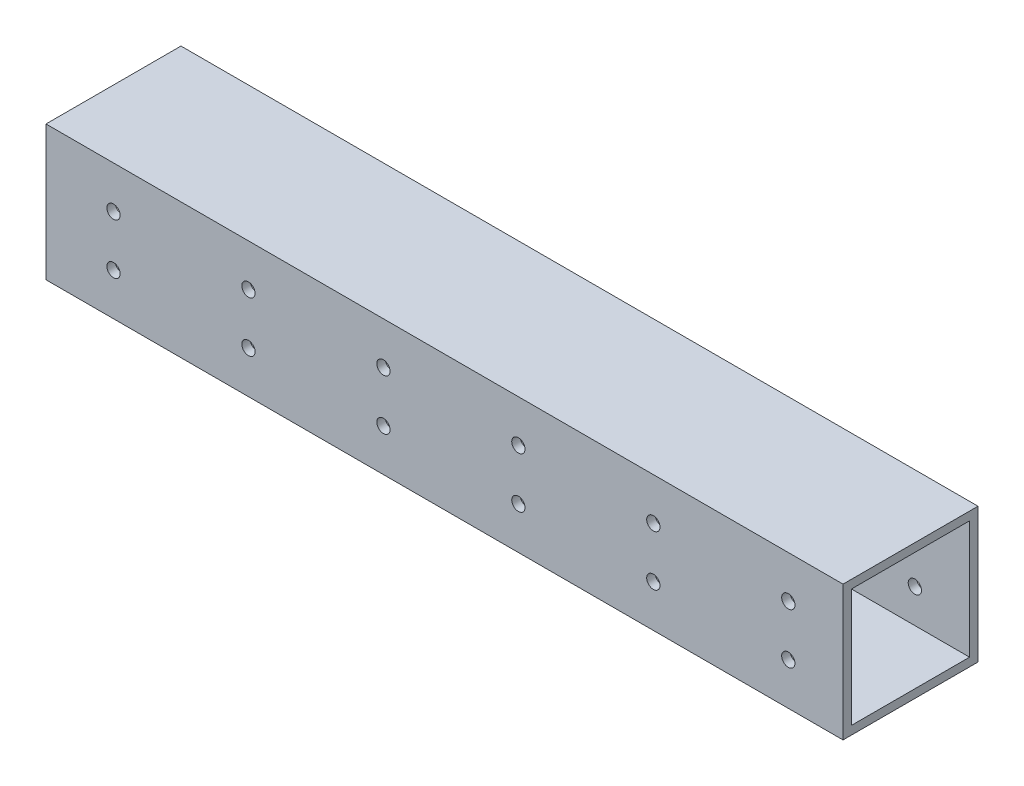
ISO-10303-21;
HEADER;
FILE_DESCRIPTION(('STEP AP214'),'2;1');
FILE_NAME('part.step','',(''),(''),'','','');
FILE_SCHEMA(('AUTOMOTIVE_DESIGN { 1 0 10303 214 1 1 1 1 }'));
ENDSEC;
DATA;
#1=APPLICATION_CONTEXT('core data for automotive mechanical design processes');
#2=APPLICATION_PROTOCOL_DEFINITION('international standard','automotive_design',2000,#1);
#3=PRODUCT_CONTEXT('',#1,'mechanical');
#4=PRODUCT('Part','Part','',(#3));
#5=PRODUCT_RELATED_PRODUCT_CATEGORY('part','',(#4));
#6=PRODUCT_DEFINITION_FORMATION('','',#4);
#7=PRODUCT_DEFINITION_CONTEXT('part definition',#1,'design');
#8=PRODUCT_DEFINITION('design','',#6,#7);
#9=PRODUCT_DEFINITION_SHAPE('','',#8);
#10=(LENGTH_UNIT() NAMED_UNIT(*) SI_UNIT(.MILLI.,.METRE.));
#11=(NAMED_UNIT(*) PLANE_ANGLE_UNIT() SI_UNIT($,.RADIAN.));
#12=(NAMED_UNIT(*) SI_UNIT($,.STERADIAN.) SOLID_ANGLE_UNIT());
#13=UNCERTAINTY_MEASURE_WITH_UNIT(LENGTH_MEASURE(1.E-05),#10,'distance_accuracy_value','');
#14=(GEOMETRIC_REPRESENTATION_CONTEXT(3) GLOBAL_UNCERTAINTY_ASSIGNED_CONTEXT((#13)) GLOBAL_UNIT_ASSIGNED_CONTEXT((#10,
#11,#12)) REPRESENTATION_CONTEXT('',''));
#15=CARTESIAN_POINT('',(0.,0.,0.));
#16=DIRECTION('',(0.,0.,1.));
#17=DIRECTION('',(1.,0.,0.));
#18=AXIS2_PLACEMENT_3D('',#15,#16,#17);
#19=CARTESIAN_POINT('',(300.,3.175,0.));
#20=DIRECTION('',(0.,1.,0.));
#21=DIRECTION('',(0.,0.,1.));
#22=AXIS2_PLACEMENT_3D('',#19,#20,#21);
#23=PLANE('',#22);
#24=DIRECTION('',(0.,0.,-1.));
#25=VECTOR('',#24,1.);
#26=CARTESIAN_POINT('',(0.,3.175,0.));
#27=LINE('',#26,#25);
#28=CARTESIAN_POINT('',(0.,3.175,-3.175));
#29=VERTEX_POINT('',#28);
#30=CARTESIAN_POINT('',(0.,3.175,-47.625));
#31=VERTEX_POINT('',#30);
#32=EDGE_CURVE('E239',#29,#31,#27,.T.);
#33=ORIENTED_EDGE('',*,*,#32,.F.);
#34=DIRECTION('',(-1.,0.,0.));
#35=VECTOR('',#34,1.);
#36=CARTESIAN_POINT('',(300.,3.175,-3.175));
#37=LINE('',#36,#35);
#38=CARTESIAN_POINT('',(300.,3.175,-3.175));
#39=VERTEX_POINT('',#38);
#40=EDGE_CURVE('E11',#39,#29,#37,.T.);
#41=ORIENTED_EDGE('',*,*,#40,.F.);
#42=DIRECTION('',(0.,0.,-1.));
#43=VECTOR('',#42,1.);
#44=CARTESIAN_POINT('',(300.,3.175,0.));
#45=LINE('',#44,#43);
#46=CARTESIAN_POINT('',(300.,3.175,-47.625));
#47=VERTEX_POINT('',#46);
#48=EDGE_CURVE('E123',#39,#47,#45,.T.);
#49=ORIENTED_EDGE('',*,*,#48,.T.);
#50=DIRECTION('',(-1.,0.,0.));
#51=VECTOR('',#50,1.);
#52=CARTESIAN_POINT('',(300.,3.175,-47.625));
#53=LINE('',#52,#51);
#54=EDGE_CURVE('E56',#47,#31,#53,.T.);
#55=ORIENTED_EDGE('',*,*,#54,.T.);
#56=EDGE_LOOP('',(#33,#41,#49,#55));
#57=FACE_BOUND('',#56,.T.);
#58=ADVANCED_FACE('F37',(#57),#23,.T.);
#59=CARTESIAN_POINT('',(300.,0.,-3.175));
#60=DIRECTION('',(0.,0.,1.));
#61=DIRECTION('',(1.,0.,0.));
#62=AXIS2_PLACEMENT_3D('',#59,#60,#61);
#63=PLANE('',#62);
#64=CARTESIAN_POINT('',(279.4,15.875,-3.17499999999998));
#65=DIRECTION('',(0.,0.,1.));
#66=DIRECTION('',(1.,0.,0.));
#67=AXIS2_PLACEMENT_3D('',#64,#65,#66);
#68=CIRCLE('',#67,2.50000000000002);
#69=CARTESIAN_POINT('',(281.9,15.875,-3.17499999999998));
#70=VERTEX_POINT('',#69);
#71=EDGE_CURVE('E212',#70,#70,#68,.T.);
#72=ORIENTED_EDGE('',*,*,#71,.T.);
#73=EDGE_LOOP('',(#72));
#74=FACE_BOUND('',#73,.T.);
#75=CARTESIAN_POINT('',(76.2,34.925,-3.17499999999998));
#76=DIRECTION('',(0.,0.,1.));
#77=DIRECTION('',(1.,0.,0.));
#78=AXIS2_PLACEMENT_3D('',#75,#76,#77);
#79=CIRCLE('',#78,2.5);
#80=CARTESIAN_POINT('',(78.7,34.925,-3.17499999999998));
#81=VERTEX_POINT('',#80);
#82=EDGE_CURVE('E197',#81,#81,#79,.T.);
#83=ORIENTED_EDGE('',*,*,#82,.T.);
#84=EDGE_LOOP('',(#83));
#85=FACE_BOUND('',#84,.T.);
#86=CARTESIAN_POINT('',(127.,34.925,-3.17499999999998));
#87=DIRECTION('',(0.,0.,1.));
#88=DIRECTION('',(1.,0.,0.));
#89=AXIS2_PLACEMENT_3D('',#86,#87,#88);
#90=CIRCLE('',#89,2.5);
#91=CARTESIAN_POINT('',(129.5,34.925,-3.17499999999998));
#92=VERTEX_POINT('',#91);
#93=EDGE_CURVE('E193',#92,#92,#90,.T.);
#94=ORIENTED_EDGE('',*,*,#93,.T.);
#95=EDGE_LOOP('',(#94));
#96=FACE_BOUND('',#95,.T.);
#97=CARTESIAN_POINT('',(177.8,34.925,-3.17499999999998));
#98=DIRECTION('',(0.,0.,1.));
#99=DIRECTION('',(1.,0.,0.));
#100=AXIS2_PLACEMENT_3D('',#97,#98,#99);
#101=CIRCLE('',#100,2.5);
#102=CARTESIAN_POINT('',(180.3,34.925,-3.17499999999998));
#103=VERTEX_POINT('',#102);
#104=EDGE_CURVE('E189',#103,#103,#101,.T.);
#105=ORIENTED_EDGE('',*,*,#104,.T.);
#106=EDGE_LOOP('',(#105));
#107=FACE_BOUND('',#106,.T.);
#108=CARTESIAN_POINT('',(228.6,15.875,-3.17499999999998));
#109=DIRECTION('',(0.,0.,1.));
#110=DIRECTION('',(1.,0.,0.));
#111=AXIS2_PLACEMENT_3D('',#108,#109,#110);
#112=CIRCLE('',#111,2.5);
#113=CARTESIAN_POINT('',(231.1,15.875,-3.17499999999998));
#114=VERTEX_POINT('',#113);
#115=EDGE_CURVE('E185',#114,#114,#112,.T.);
#116=ORIENTED_EDGE('',*,*,#115,.T.);
#117=EDGE_LOOP('',(#116));
#118=FACE_BOUND('',#117,.T.);
#119=CARTESIAN_POINT('',(177.8,15.875,-3.17499999999998));
#120=DIRECTION('',(0.,0.,1.));
#121=DIRECTION('',(1.,0.,0.));
#122=AXIS2_PLACEMENT_3D('',#119,#120,#121);
#123=CIRCLE('',#122,2.5);
#124=CARTESIAN_POINT('',(180.3,15.875,-3.17499999999998));
#125=VERTEX_POINT('',#124);
#126=EDGE_CURVE('E180',#125,#125,#123,.T.);
#127=ORIENTED_EDGE('',*,*,#126,.T.);
#128=EDGE_LOOP('',(#127));
#129=FACE_BOUND('',#128,.T.);
#130=CARTESIAN_POINT('',(127.,15.875,-3.17499999999998));
#131=DIRECTION('',(0.,0.,1.));
#132=DIRECTION('',(1.,0.,0.));
#133=AXIS2_PLACEMENT_3D('',#130,#131,#132);
#134=CIRCLE('',#133,2.5);
#135=CARTESIAN_POINT('',(129.5,15.875,-3.17499999999998));
#136=VERTEX_POINT('',#135);
#137=EDGE_CURVE('E175',#136,#136,#134,.T.);
#138=ORIENTED_EDGE('',*,*,#137,.T.);
#139=EDGE_LOOP('',(#138));
#140=FACE_BOUND('',#139,.T.);
#141=CARTESIAN_POINT('',(76.2,15.875,-3.17499999999998));
#142=DIRECTION('',(0.,0.,1.));
#143=DIRECTION('',(1.,0.,0.));
#144=AXIS2_PLACEMENT_3D('',#141,#142,#143);
#145=CIRCLE('',#144,2.5);
#146=CARTESIAN_POINT('',(78.7,15.875,-3.17499999999998));
#147=VERTEX_POINT('',#146);
#148=EDGE_CURVE('E170',#147,#147,#145,.T.);
#149=ORIENTED_EDGE('',*,*,#148,.T.);
#150=EDGE_LOOP('',(#149));
#151=FACE_BOUND('',#150,.T.);
#152=CARTESIAN_POINT('',(228.6,34.925,-3.17499999999998));
#153=DIRECTION('',(0.,0.,1.));
#154=DIRECTION('',(1.,0.,0.));
#155=AXIS2_PLACEMENT_3D('',#152,#153,#154);
#156=CIRCLE('',#155,2.5);
#157=CARTESIAN_POINT('',(231.1,34.925,-3.17499999999998));
#158=VERTEX_POINT('',#157);
#159=EDGE_CURVE('E165',#158,#158,#156,.T.);
#160=ORIENTED_EDGE('',*,*,#159,.T.);
#161=EDGE_LOOP('',(#160));
#162=FACE_BOUND('',#161,.T.);
#163=CARTESIAN_POINT('',(279.4,34.925,-3.17499999999998));
#164=DIRECTION('',(0.,0.,1.));
#165=DIRECTION('',(1.,0.,0.));
#166=AXIS2_PLACEMENT_3D('',#163,#164,#165);
#167=CIRCLE('',#166,2.50000000000002);
#168=CARTESIAN_POINT('',(281.9,34.925,-3.17499999999998));
#169=VERTEX_POINT('',#168);
#170=EDGE_CURVE('E160',#169,#169,#167,.T.);
#171=ORIENTED_EDGE('',*,*,#170,.T.);
#172=EDGE_LOOP('',(#171));
#173=FACE_BOUND('',#172,.T.);
#174=CARTESIAN_POINT('',(25.4,34.925,-3.17499999999998));
#175=DIRECTION('',(0.,0.,1.));
#176=DIRECTION('',(1.,0.,0.));
#177=AXIS2_PLACEMENT_3D('',#174,#175,#176);
#178=CIRCLE('',#177,2.5);
#179=CARTESIAN_POINT('',(27.9,34.925,-3.17499999999998));
#180=VERTEX_POINT('',#179);
#181=EDGE_CURVE('E155',#180,#180,#178,.T.);
#182=ORIENTED_EDGE('',*,*,#181,.T.);
#183=EDGE_LOOP('',(#182));
#184=FACE_BOUND('',#183,.T.);
#185=CARTESIAN_POINT('',(25.4,15.875,-3.17499999999998));
#186=DIRECTION('',(0.,0.,1.));
#187=DIRECTION('',(1.,0.,0.));
#188=AXIS2_PLACEMENT_3D('',#185,#186,#187);
#189=CIRCLE('',#188,2.5);
#190=CARTESIAN_POINT('',(27.9,15.875,-3.17499999999998));
#191=VERTEX_POINT('',#190);
#192=EDGE_CURVE('E150',#191,#191,#189,.T.);
#193=ORIENTED_EDGE('',*,*,#192,.T.);
#194=EDGE_LOOP('',(#193));
#195=FACE_BOUND('',#194,.T.);
#196=DIRECTION('',(0.,1.,0.));
#197=VECTOR('',#196,1.);
#198=CARTESIAN_POINT('',(0.,0.,-3.175));
#199=LINE('',#198,#197);
#200=CARTESIAN_POINT('',(0.,47.625,-3.175));
#201=VERTEX_POINT('',#200);
#202=EDGE_CURVE('E128',#29,#201,#199,.T.);
#203=ORIENTED_EDGE('',*,*,#202,.T.);
#204=DIRECTION('',(-1.,0.,0.));
#205=VECTOR('',#204,1.);
#206=CARTESIAN_POINT('',(300.,47.625,-3.175));
#207=LINE('',#206,#205);
#208=CARTESIAN_POINT('',(300.,47.625,-3.175));
#209=VERTEX_POINT('',#208);
#210=EDGE_CURVE('E47',#209,#201,#207,.T.);
#211=ORIENTED_EDGE('',*,*,#210,.F.);
#212=DIRECTION('',(0.,1.,0.));
#213=VECTOR('',#212,1.);
#214=CARTESIAN_POINT('',(300.,0.,-3.175));
#215=LINE('',#214,#213);
#216=EDGE_CURVE('E118',#39,#209,#215,.T.);
#217=ORIENTED_EDGE('',*,*,#216,.F.);
#218=ORIENTED_EDGE('',*,*,#40,.T.);
#219=EDGE_LOOP('',(#203,#211,#217,#218));
#220=FACE_BOUND('',#219,.T.);
#221=ADVANCED_FACE('F126',(#74,#85,#96,#107,#118,#129,#140,#151,#162,#173,#184,#195,#220),#63,.F.);
#222=CARTESIAN_POINT('',(300.,47.625,0.));
#223=DIRECTION('',(0.,1.,0.));
#224=DIRECTION('',(0.,0.,1.));
#225=AXIS2_PLACEMENT_3D('',#222,#223,#224);
#226=PLANE('',#225);
#227=DIRECTION('',(0.,0.,-1.));
#228=VECTOR('',#227,1.);
#229=CARTESIAN_POINT('',(0.,47.625,0.));
#230=LINE('',#229,#228);
#231=CARTESIAN_POINT('',(0.,47.625,-47.625));
#232=VERTEX_POINT('',#231);
#233=EDGE_CURVE('E242',#201,#232,#230,.T.);
#234=ORIENTED_EDGE('',*,*,#233,.T.);
#235=DIRECTION('',(-1.,0.,0.));
#236=VECTOR('',#235,1.);
#237=CARTESIAN_POINT('',(300.,47.625,-47.625));
#238=LINE('',#237,#236);
#239=CARTESIAN_POINT('',(300.,47.625,-47.625));
#240=VERTEX_POINT('',#239);
#241=EDGE_CURVE('E82',#240,#232,#238,.T.);
#242=ORIENTED_EDGE('',*,*,#241,.F.);
#243=DIRECTION('',(0.,0.,-1.));
#244=VECTOR('',#243,1.);
#245=CARTESIAN_POINT('',(300.,47.625,0.));
#246=LINE('',#245,#244);
#247=EDGE_CURVE('E110',#209,#240,#246,.T.);
#248=ORIENTED_EDGE('',*,*,#247,.F.);
#249=ORIENTED_EDGE('',*,*,#210,.T.);
#250=EDGE_LOOP('',(#234,#242,#248,#249));
#251=FACE_BOUND('',#250,.T.);
#252=ADVANCED_FACE('F112',(#251),#226,.F.);
#253=CARTESIAN_POINT('',(300.,0.,0.));
#254=DIRECTION('',(0.,1.,0.));
#255=DIRECTION('',(0.,0.,1.));
#256=AXIS2_PLACEMENT_3D('',#253,#254,#255);
#257=PLANE('',#256);
#258=DIRECTION('',(0.,0.,-1.));
#259=VECTOR('',#258,1.);
#260=CARTESIAN_POINT('',(0.,0.,0.));
#261=LINE('',#260,#259);
#262=CARTESIAN_POINT('',(0.,0.,0.));
#263=VERTEX_POINT('',#262);
#264=CARTESIAN_POINT('',(0.,0.,-50.8));
#265=VERTEX_POINT('',#264);
#266=EDGE_CURVE('E215',#263,#265,#261,.T.);
#267=ORIENTED_EDGE('',*,*,#266,.T.);
#268=DIRECTION('',(-1.,0.,0.));
#269=VECTOR('',#268,1.);
#270=CARTESIAN_POINT('',(300.,0.,-50.8));
#271=LINE('',#270,#269);
#272=CARTESIAN_POINT('',(300.,0.,-50.8));
#273=VERTEX_POINT('',#272);
#274=EDGE_CURVE('E139',#273,#265,#271,.T.);
#275=ORIENTED_EDGE('',*,*,#274,.F.);
#276=DIRECTION('',(0.,0.,-1.));
#277=VECTOR('',#276,1.);
#278=CARTESIAN_POINT('',(300.,0.,0.));
#279=LINE('',#278,#277);
#280=CARTESIAN_POINT('',(300.,0.,0.));
#281=VERTEX_POINT('',#280);
#282=EDGE_CURVE('E216',#281,#273,#279,.T.);
#283=ORIENTED_EDGE('',*,*,#282,.F.);
#284=DIRECTION('',(-1.,0.,0.));
#285=VECTOR('',#284,1.);
#286=CARTESIAN_POINT('',(300.,0.,0.));
#287=LINE('',#286,#285);
#288=EDGE_CURVE('E133',#281,#263,#287,.T.);
#289=ORIENTED_EDGE('',*,*,#288,.T.);
#290=EDGE_LOOP('',(#267,#275,#283,#289));
#291=FACE_BOUND('',#290,.T.);
#292=ADVANCED_FACE('F39',(#291),#257,.F.);
#293=CARTESIAN_POINT('',(300.,0.,-50.8));
#294=DIRECTION('',(0.,0.,1.));
#295=DIRECTION('',(1.,0.,0.));
#296=AXIS2_PLACEMENT_3D('',#293,#294,#295);
#297=PLANE('',#296);
#298=CARTESIAN_POINT('',(279.4,15.875,-50.8));
#299=DIRECTION('',(0.,0.,1.));
#300=DIRECTION('',(1.,0.,0.));
#301=AXIS2_PLACEMENT_3D('',#298,#299,#300);
#302=CIRCLE('',#301,2.50000000000002);
#303=CARTESIAN_POINT('',(281.9,15.875,-50.8));
#304=VERTEX_POINT('',#303);
#305=EDGE_CURVE('E209',#304,#304,#302,.T.);
#306=ORIENTED_EDGE('',*,*,#305,.T.);
#307=EDGE_LOOP('',(#306));
#308=FACE_BOUND('',#307,.T.);
#309=CARTESIAN_POINT('',(76.2,34.925,-50.8));
#310=DIRECTION('',(0.,0.,1.));
#311=DIRECTION('',(1.,0.,0.));
#312=AXIS2_PLACEMENT_3D('',#309,#310,#311);
#313=CIRCLE('',#312,2.5);
#314=CARTESIAN_POINT('',(78.7,34.925,-50.8));
#315=VERTEX_POINT('',#314);
#316=EDGE_CURVE('E192',#315,#315,#313,.T.);
#317=ORIENTED_EDGE('',*,*,#316,.T.);
#318=EDGE_LOOP('',(#317));
#319=FACE_BOUND('',#318,.T.);
#320=CARTESIAN_POINT('',(127.,34.925,-50.8));
#321=DIRECTION('',(0.,0.,1.));
#322=DIRECTION('',(1.,0.,0.));
#323=AXIS2_PLACEMENT_3D('',#320,#321,#322);
#324=CIRCLE('',#323,2.5);
#325=CARTESIAN_POINT('',(129.5,34.925,-50.8));
#326=VERTEX_POINT('',#325);
#327=EDGE_CURVE('E188',#326,#326,#324,.T.);
#328=ORIENTED_EDGE('',*,*,#327,.T.);
#329=EDGE_LOOP('',(#328));
#330=FACE_BOUND('',#329,.T.);
#331=CARTESIAN_POINT('',(177.8,34.925,-50.8));
#332=DIRECTION('',(0.,0.,1.));
#333=DIRECTION('',(1.,0.,0.));
#334=AXIS2_PLACEMENT_3D('',#331,#332,#333);
#335=CIRCLE('',#334,2.5);
#336=CARTESIAN_POINT('',(180.3,34.925,-50.8));
#337=VERTEX_POINT('',#336);
#338=EDGE_CURVE('E184',#337,#337,#335,.T.);
#339=ORIENTED_EDGE('',*,*,#338,.T.);
#340=EDGE_LOOP('',(#339));
#341=FACE_BOUND('',#340,.T.);
#342=CARTESIAN_POINT('',(228.6,15.875,-50.8));
#343=DIRECTION('',(0.,0.,1.));
#344=DIRECTION('',(1.,0.,0.));
#345=AXIS2_PLACEMENT_3D('',#342,#343,#344);
#346=CIRCLE('',#345,2.5);
#347=CARTESIAN_POINT('',(231.1,15.875,-50.8));
#348=VERTEX_POINT('',#347);
#349=EDGE_CURVE('E179',#348,#348,#346,.T.);
#350=ORIENTED_EDGE('',*,*,#349,.T.);
#351=EDGE_LOOP('',(#350));
#352=FACE_BOUND('',#351,.T.);
#353=CARTESIAN_POINT('',(177.8,15.875,-50.8));
#354=DIRECTION('',(0.,0.,1.));
#355=DIRECTION('',(1.,0.,0.));
#356=AXIS2_PLACEMENT_3D('',#353,#354,#355);
#357=CIRCLE('',#356,2.5);
#358=CARTESIAN_POINT('',(180.3,15.875,-50.8));
#359=VERTEX_POINT('',#358);
#360=EDGE_CURVE('E174',#359,#359,#357,.T.);
#361=ORIENTED_EDGE('',*,*,#360,.T.);
#362=EDGE_LOOP('',(#361));
#363=FACE_BOUND('',#362,.T.);
#364=CARTESIAN_POINT('',(127.,15.875,-50.8));
#365=DIRECTION('',(0.,0.,1.));
#366=DIRECTION('',(1.,0.,0.));
#367=AXIS2_PLACEMENT_3D('',#364,#365,#366);
#368=CIRCLE('',#367,2.5);
#369=CARTESIAN_POINT('',(129.5,15.875,-50.8));
#370=VERTEX_POINT('',#369);
#371=EDGE_CURVE('E169',#370,#370,#368,.T.);
#372=ORIENTED_EDGE('',*,*,#371,.T.);
#373=EDGE_LOOP('',(#372));
#374=FACE_BOUND('',#373,.T.);
#375=CARTESIAN_POINT('',(76.2,15.875,-50.8));
#376=DIRECTION('',(0.,0.,1.));
#377=DIRECTION('',(1.,0.,0.));
#378=AXIS2_PLACEMENT_3D('',#375,#376,#377);
#379=CIRCLE('',#378,2.5);
#380=CARTESIAN_POINT('',(78.7,15.875,-50.8));
#381=VERTEX_POINT('',#380);
#382=EDGE_CURVE('E164',#381,#381,#379,.T.);
#383=ORIENTED_EDGE('',*,*,#382,.T.);
#384=EDGE_LOOP('',(#383));
#385=FACE_BOUND('',#384,.T.);
#386=CARTESIAN_POINT('',(228.6,34.925,-50.8));
#387=DIRECTION('',(0.,0.,1.));
#388=DIRECTION('',(1.,0.,0.));
#389=AXIS2_PLACEMENT_3D('',#386,#387,#388);
#390=CIRCLE('',#389,2.5);
#391=CARTESIAN_POINT('',(231.1,34.925,-50.8));
#392=VERTEX_POINT('',#391);
#393=EDGE_CURVE('E159',#392,#392,#390,.T.);
#394=ORIENTED_EDGE('',*,*,#393,.T.);
#395=EDGE_LOOP('',(#394));
#396=FACE_BOUND('',#395,.T.);
#397=CARTESIAN_POINT('',(279.4,34.925,-50.8));
#398=DIRECTION('',(0.,0.,1.));
#399=DIRECTION('',(1.,0.,0.));
#400=AXIS2_PLACEMENT_3D('',#397,#398,#399);
#401=CIRCLE('',#400,2.50000000000002);
#402=CARTESIAN_POINT('',(281.9,34.925,-50.8));
#403=VERTEX_POINT('',#402);
#404=EDGE_CURVE('E154',#403,#403,#401,.T.);
#405=ORIENTED_EDGE('',*,*,#404,.T.);
#406=EDGE_LOOP('',(#405));
#407=FACE_BOUND('',#406,.T.);
#408=CARTESIAN_POINT('',(25.4,34.925,-50.8));
#409=DIRECTION('',(0.,0.,1.));
#410=DIRECTION('',(1.,0.,0.));
#411=AXIS2_PLACEMENT_3D('',#408,#409,#410);
#412=CIRCLE('',#411,2.5);
#413=CARTESIAN_POINT('',(27.9,34.925,-50.8));
#414=VERTEX_POINT('',#413);
#415=EDGE_CURVE('E149',#414,#414,#412,.T.);
#416=ORIENTED_EDGE('',*,*,#415,.T.);
#417=EDGE_LOOP('',(#416));
#418=FACE_BOUND('',#417,.T.);
#419=CARTESIAN_POINT('',(25.4,15.875,-50.8));
#420=DIRECTION('',(0.,0.,1.));
#421=DIRECTION('',(1.,0.,0.));
#422=AXIS2_PLACEMENT_3D('',#419,#420,#421);
#423=CIRCLE('',#422,2.5);
#424=CARTESIAN_POINT('',(27.9,15.875,-50.8));
#425=VERTEX_POINT('',#424);
#426=EDGE_CURVE('E144',#425,#425,#423,.T.);
#427=ORIENTED_EDGE('',*,*,#426,.T.);
#428=EDGE_LOOP('',(#427));
#429=FACE_BOUND('',#428,.T.);
#430=DIRECTION('',(0.,1.,0.));
#431=VECTOR('',#430,1.);
#432=CARTESIAN_POINT('',(0.,0.,-50.8));
#433=LINE('',#432,#431);
#434=CARTESIAN_POINT('',(0.,50.8,-50.8));
#435=VERTEX_POINT('',#434);
#436=EDGE_CURVE('E230',#265,#435,#433,.T.);
#437=ORIENTED_EDGE('',*,*,#436,.T.);
#438=DIRECTION('',(-1.,0.,0.));
#439=VECTOR('',#438,1.);
#440=CARTESIAN_POINT('',(300.,50.8,-50.8));
#441=LINE('',#440,#439);
#442=CARTESIAN_POINT('',(300.,50.8,-50.8));
#443=VERTEX_POINT('',#442);
#444=EDGE_CURVE('E137',#443,#435,#441,.T.);
#445=ORIENTED_EDGE('',*,*,#444,.F.);
#446=DIRECTION('',(0.,1.,0.));
#447=VECTOR('',#446,1.);
#448=CARTESIAN_POINT('',(300.,0.,-50.8));
#449=LINE('',#448,#447);
#450=EDGE_CURVE('E95',#273,#443,#449,.T.);
#451=ORIENTED_EDGE('',*,*,#450,.F.);
#452=ORIENTED_EDGE('',*,*,#274,.T.);
#453=EDGE_LOOP('',(#437,#445,#451,#452));
#454=FACE_BOUND('',#453,.T.);
#455=ADVANCED_FACE('F274',(#308,#319,#330,#341,#352,#363,#374,#385,#396,#407,#418,#429,#454),
#297,.F.);
#456=CARTESIAN_POINT('',(300.,50.8,0.));
#457=DIRECTION('',(0.,1.,0.));
#458=DIRECTION('',(0.,0.,1.));
#459=AXIS2_PLACEMENT_3D('',#456,#457,#458);
#460=PLANE('',#459);
#461=DIRECTION('',(0.,0.,-1.));
#462=VECTOR('',#461,1.);
#463=CARTESIAN_POINT('',(0.,50.8,0.));
#464=LINE('',#463,#462);
#465=CARTESIAN_POINT('',(0.,50.8,0.));
#466=VERTEX_POINT('',#465);
#467=EDGE_CURVE('E233',#466,#435,#464,.T.);
#468=ORIENTED_EDGE('',*,*,#467,.F.);
#469=DIRECTION('',(-1.,0.,0.));
#470=VECTOR('',#469,1.);
#471=CARTESIAN_POINT('',(300.,50.8,0.));
#472=LINE('',#471,#470);
#473=CARTESIAN_POINT('',(300.,50.8,0.));
#474=VERTEX_POINT('',#473);
#475=EDGE_CURVE('E135',#474,#466,#472,.T.);
#476=ORIENTED_EDGE('',*,*,#475,.F.);
#477=DIRECTION('',(0.,0.,-1.));
#478=VECTOR('',#477,1.);
#479=CARTESIAN_POINT('',(300.,50.8,0.));
#480=LINE('',#479,#478);
#481=EDGE_CURVE('E220',#474,#443,#480,.T.);
#482=ORIENTED_EDGE('',*,*,#481,.T.);
#483=ORIENTED_EDGE('',*,*,#444,.T.);
#484=EDGE_LOOP('',(#468,#476,#482,#483));
#485=FACE_BOUND('',#484,.T.);
#486=ADVANCED_FACE('F258',(#485),#460,.T.);
#487=CARTESIAN_POINT('',(300.,0.,0.));
#488=DIRECTION('',(0.,0.,1.));
#489=DIRECTION('',(1.,0.,0.));
#490=AXIS2_PLACEMENT_3D('',#487,#488,#489);
#491=PLANE('',#490);
#492=CARTESIAN_POINT('',(279.4,15.875,0.));
#493=DIRECTION('',(0.,0.,1.));
#494=DIRECTION('',(1.,0.,0.));
#495=AXIS2_PLACEMENT_3D('',#492,#493,#494);
#496=CIRCLE('',#495,2.50000000000002);
#497=CARTESIAN_POINT('',(281.9,15.875,0.));
#498=VERTEX_POINT('',#497);
#499=EDGE_CURVE('E456',#498,#498,#496,.T.);
#500=ORIENTED_EDGE('',*,*,#499,.F.);
#501=EDGE_LOOP('',(#500));
#502=FACE_BOUND('',#501,.T.);
#503=CARTESIAN_POINT('',(76.2,34.925,0.));
#504=DIRECTION('',(0.,0.,1.));
#505=DIRECTION('',(1.,0.,0.));
#506=AXIS2_PLACEMENT_3D('',#503,#504,#505);
#507=CIRCLE('',#506,2.5);
#508=CARTESIAN_POINT('',(78.7,34.925,0.));
#509=VERTEX_POINT('',#508);
#510=EDGE_CURVE('E464',#509,#509,#507,.T.);
#511=ORIENTED_EDGE('',*,*,#510,.F.);
#512=EDGE_LOOP('',(#511));
#513=FACE_BOUND('',#512,.T.);
#514=CARTESIAN_POINT('',(127.,34.925,0.));
#515=DIRECTION('',(0.,0.,1.));
#516=DIRECTION('',(1.,0.,0.));
#517=AXIS2_PLACEMENT_3D('',#514,#515,#516);
#518=CIRCLE('',#517,2.5);
#519=CARTESIAN_POINT('',(129.5,34.925,0.));
#520=VERTEX_POINT('',#519);
#521=EDGE_CURVE('E467',#520,#520,#518,.T.);
#522=ORIENTED_EDGE('',*,*,#521,.F.);
#523=EDGE_LOOP('',(#522));
#524=FACE_BOUND('',#523,.T.);
#525=CARTESIAN_POINT('',(177.8,34.925,0.));
#526=DIRECTION('',(0.,0.,1.));
#527=DIRECTION('',(1.,0.,0.));
#528=AXIS2_PLACEMENT_3D('',#525,#526,#527);
#529=CIRCLE('',#528,2.5);
#530=CARTESIAN_POINT('',(180.3,34.925,0.));
#531=VERTEX_POINT('',#530);
#532=EDGE_CURVE('E470',#531,#531,#529,.T.);
#533=ORIENTED_EDGE('',*,*,#532,.F.);
#534=EDGE_LOOP('',(#533));
#535=FACE_BOUND('',#534,.T.);
#536=CARTESIAN_POINT('',(228.6,15.875,0.));
#537=DIRECTION('',(0.,0.,1.));
#538=DIRECTION('',(1.,0.,0.));
#539=AXIS2_PLACEMENT_3D('',#536,#537,#538);
#540=CIRCLE('',#539,2.5);
#541=CARTESIAN_POINT('',(231.1,15.875,0.));
#542=VERTEX_POINT('',#541);
#543=EDGE_CURVE('E452',#542,#542,#540,.T.);
#544=ORIENTED_EDGE('',*,*,#543,.F.);
#545=EDGE_LOOP('',(#544));
#546=FACE_BOUND('',#545,.T.);
#547=CARTESIAN_POINT('',(177.8,15.875,0.));
#548=DIRECTION('',(0.,0.,1.));
#549=DIRECTION('',(1.,0.,0.));
#550=AXIS2_PLACEMENT_3D('',#547,#548,#549);
#551=CIRCLE('',#550,2.5);
#552=CARTESIAN_POINT('',(180.3,15.875,0.));
#553=VERTEX_POINT('',#552);
#554=EDGE_CURVE('E455',#553,#553,#551,.T.);
#555=ORIENTED_EDGE('',*,*,#554,.F.);
#556=EDGE_LOOP('',(#555));
#557=FACE_BOUND('',#556,.T.);
#558=CARTESIAN_POINT('',(127.,15.875,0.));
#559=DIRECTION('',(0.,0.,1.));
#560=DIRECTION('',(1.,0.,0.));
#561=AXIS2_PLACEMENT_3D('',#558,#559,#560);
#562=CIRCLE('',#561,2.5);
#563=CARTESIAN_POINT('',(129.5,15.875,0.));
#564=VERTEX_POINT('',#563);
#565=EDGE_CURVE('E459',#564,#564,#562,.T.);
#566=ORIENTED_EDGE('',*,*,#565,.F.);
#567=EDGE_LOOP('',(#566));
#568=FACE_BOUND('',#567,.T.);
#569=CARTESIAN_POINT('',(76.2,15.875,0.));
#570=DIRECTION('',(0.,0.,1.));
#571=DIRECTION('',(1.,0.,0.));
#572=AXIS2_PLACEMENT_3D('',#569,#570,#571);
#573=CIRCLE('',#572,2.5);
#574=CARTESIAN_POINT('',(78.7,15.875,0.));
#575=VERTEX_POINT('',#574);
#576=EDGE_CURVE('E451',#575,#575,#573,.T.);
#577=ORIENTED_EDGE('',*,*,#576,.F.);
#578=EDGE_LOOP('',(#577));
#579=FACE_BOUND('',#578,.T.);
#580=CARTESIAN_POINT('',(228.6,34.925,0.));
#581=DIRECTION('',(0.,0.,1.));
#582=DIRECTION('',(1.,0.,0.));
#583=AXIS2_PLACEMENT_3D('',#580,#581,#582);
#584=CIRCLE('',#583,2.5);
#585=CARTESIAN_POINT('',(231.1,34.925,0.));
#586=VERTEX_POINT('',#585);
#587=EDGE_CURVE('E473',#586,#586,#584,.T.);
#588=ORIENTED_EDGE('',*,*,#587,.F.);
#589=EDGE_LOOP('',(#588));
#590=FACE_BOUND('',#589,.T.);
#591=CARTESIAN_POINT('',(279.4,34.925,0.));
#592=DIRECTION('',(0.,0.,1.));
#593=DIRECTION('',(1.,0.,0.));
#594=AXIS2_PLACEMENT_3D('',#591,#592,#593);
#595=CIRCLE('',#594,2.50000000000002);
#596=CARTESIAN_POINT('',(281.9,34.925,0.));
#597=VERTEX_POINT('',#596);
#598=EDGE_CURVE('E479',#597,#597,#595,.T.);
#599=ORIENTED_EDGE('',*,*,#598,.F.);
#600=EDGE_LOOP('',(#599));
#601=FACE_BOUND('',#600,.T.);
#602=CARTESIAN_POINT('',(25.4,34.925,0.));
#603=DIRECTION('',(0.,0.,1.));
#604=DIRECTION('',(1.,0.,0.));
#605=AXIS2_PLACEMENT_3D('',#602,#603,#604);
#606=CIRCLE('',#605,2.5);
#607=CARTESIAN_POINT('',(27.9,34.925,0.));
#608=VERTEX_POINT('',#607);
#609=EDGE_CURVE('E476',#608,#608,#606,.T.);
#610=ORIENTED_EDGE('',*,*,#609,.F.);
#611=EDGE_LOOP('',(#610));
#612=FACE_BOUND('',#611,.T.);
#613=CARTESIAN_POINT('',(25.4,15.875,0.));
#614=DIRECTION('',(0.,0.,1.));
#615=DIRECTION('',(1.,0.,0.));
#616=AXIS2_PLACEMENT_3D('',#613,#614,#615);
#617=CIRCLE('',#616,2.5);
#618=CARTESIAN_POINT('',(27.9,15.875,0.));
#619=VERTEX_POINT('',#618);
#620=EDGE_CURVE('E145',#619,#619,#617,.T.);
#621=ORIENTED_EDGE('',*,*,#620,.F.);
#622=EDGE_LOOP('',(#621));
#623=FACE_BOUND('',#622,.T.);
#624=DIRECTION('',(0.,1.,0.));
#625=VECTOR('',#624,1.);
#626=CARTESIAN_POINT('',(0.,0.,0.));
#627=LINE('',#626,#625);
#628=EDGE_CURVE('E236',#263,#466,#627,.T.);
#629=ORIENTED_EDGE('',*,*,#628,.F.);
#630=ORIENTED_EDGE('',*,*,#288,.F.);
#631=DIRECTION('',(0.,1.,0.));
#632=VECTOR('',#631,1.);
#633=CARTESIAN_POINT('',(300.,0.,0.));
#634=LINE('',#633,#632);
#635=EDGE_CURVE('E223',#281,#474,#634,.T.);
#636=ORIENTED_EDGE('',*,*,#635,.T.);
#637=ORIENTED_EDGE('',*,*,#475,.T.);
#638=EDGE_LOOP('',(#629,#630,#636,#637));
#639=FACE_BOUND('',#638,.T.);
#640=ADVANCED_FACE('F249',(#502,#513,#524,#535,#546,#557,#568,#579,#590,#601,#612,#623,#639),
#491,.T.);
#641=CARTESIAN_POINT('',(300.,0.,-47.625));
#642=DIRECTION('',(0.,0.,1.));
#643=DIRECTION('',(1.,0.,0.));
#644=AXIS2_PLACEMENT_3D('',#641,#642,#643);
#645=PLANE('',#644);
#646=CARTESIAN_POINT('',(279.4,15.875,-47.625));
#647=DIRECTION('',(0.,0.,1.));
#648=DIRECTION('',(1.,0.,0.));
#649=AXIS2_PLACEMENT_3D('',#646,#647,#648);
#650=CIRCLE('',#649,2.50000000000002);
#651=CARTESIAN_POINT('',(281.9,15.875,-47.625));
#652=VERTEX_POINT('',#651);
#653=EDGE_CURVE('E41',#652,#652,#650,.T.);
#654=ORIENTED_EDGE('',*,*,#653,.F.);
#655=EDGE_LOOP('',(#654));
#656=FACE_BOUND('',#655,.T.);
#657=CARTESIAN_POINT('',(76.2,34.925,-47.625));
#658=DIRECTION('',(0.,0.,1.));
#659=DIRECTION('',(1.,0.,0.));
#660=AXIS2_PLACEMENT_3D('',#657,#658,#659);
#661=CIRCLE('',#660,2.5);
#662=CARTESIAN_POINT('',(78.7,34.925,-47.625));
#663=VERTEX_POINT('',#662);
#664=EDGE_CURVE('E190',#663,#663,#661,.T.);
#665=ORIENTED_EDGE('',*,*,#664,.F.);
#666=EDGE_LOOP('',(#665));
#667=FACE_BOUND('',#666,.T.);
#668=CARTESIAN_POINT('',(127.,34.925,-47.625));
#669=DIRECTION('',(0.,0.,1.));
#670=DIRECTION('',(1.,0.,0.));
#671=AXIS2_PLACEMENT_3D('',#668,#669,#670);
#672=CIRCLE('',#671,2.5);
#673=CARTESIAN_POINT('',(129.5,34.925,-47.625));
#674=VERTEX_POINT('',#673);
#675=EDGE_CURVE('E186',#674,#674,#672,.T.);
#676=ORIENTED_EDGE('',*,*,#675,.F.);
#677=EDGE_LOOP('',(#676));
#678=FACE_BOUND('',#677,.T.);
#679=CARTESIAN_POINT('',(177.8,34.925,-47.625));
#680=DIRECTION('',(0.,0.,1.));
#681=DIRECTION('',(1.,0.,0.));
#682=AXIS2_PLACEMENT_3D('',#679,#680,#681);
#683=CIRCLE('',#682,2.5);
#684=CARTESIAN_POINT('',(180.3,34.925,-47.625));
#685=VERTEX_POINT('',#684);
#686=EDGE_CURVE('E181',#685,#685,#683,.T.);
#687=ORIENTED_EDGE('',*,*,#686,.F.);
#688=EDGE_LOOP('',(#687));
#689=FACE_BOUND('',#688,.T.);
#690=CARTESIAN_POINT('',(228.6,15.875,-47.625));
#691=DIRECTION('',(0.,0.,1.));
#692=DIRECTION('',(1.,0.,0.));
#693=AXIS2_PLACEMENT_3D('',#690,#691,#692);
#694=CIRCLE('',#693,2.5);
#695=CARTESIAN_POINT('',(231.1,15.875,-47.625));
#696=VERTEX_POINT('',#695);
#697=EDGE_CURVE('E176',#696,#696,#694,.T.);
#698=ORIENTED_EDGE('',*,*,#697,.F.);
#699=EDGE_LOOP('',(#698));
#700=FACE_BOUND('',#699,.T.);
#701=CARTESIAN_POINT('',(177.8,15.875,-47.625));
#702=DIRECTION('',(0.,0.,1.));
#703=DIRECTION('',(1.,0.,0.));
#704=AXIS2_PLACEMENT_3D('',#701,#702,#703);
#705=CIRCLE('',#704,2.5);
#706=CARTESIAN_POINT('',(180.3,15.875,-47.625));
#707=VERTEX_POINT('',#706);
#708=EDGE_CURVE('E171',#707,#707,#705,.T.);
#709=ORIENTED_EDGE('',*,*,#708,.F.);
#710=EDGE_LOOP('',(#709));
#711=FACE_BOUND('',#710,.T.);
#712=CARTESIAN_POINT('',(127.,15.875,-47.625));
#713=DIRECTION('',(0.,0.,1.));
#714=DIRECTION('',(1.,0.,0.));
#715=AXIS2_PLACEMENT_3D('',#712,#713,#714);
#716=CIRCLE('',#715,2.5);
#717=CARTESIAN_POINT('',(129.5,15.875,-47.625));
#718=VERTEX_POINT('',#717);
#719=EDGE_CURVE('E166',#718,#718,#716,.T.);
#720=ORIENTED_EDGE('',*,*,#719,.F.);
#721=EDGE_LOOP('',(#720));
#722=FACE_BOUND('',#721,.T.);
#723=CARTESIAN_POINT('',(76.2,15.875,-47.625));
#724=DIRECTION('',(0.,0.,1.));
#725=DIRECTION('',(1.,0.,0.));
#726=AXIS2_PLACEMENT_3D('',#723,#724,#725);
#727=CIRCLE('',#726,2.5);
#728=CARTESIAN_POINT('',(78.7,15.875,-47.625));
#729=VERTEX_POINT('',#728);
#730=EDGE_CURVE('E161',#729,#729,#727,.T.);
#731=ORIENTED_EDGE('',*,*,#730,.F.);
#732=EDGE_LOOP('',(#731));
#733=FACE_BOUND('',#732,.T.);
#734=CARTESIAN_POINT('',(228.6,34.925,-47.625));
#735=DIRECTION('',(0.,0.,1.));
#736=DIRECTION('',(1.,0.,0.));
#737=AXIS2_PLACEMENT_3D('',#734,#735,#736);
#738=CIRCLE('',#737,2.5);
#739=CARTESIAN_POINT('',(231.1,34.925,-47.625));
#740=VERTEX_POINT('',#739);
#741=EDGE_CURVE('E156',#740,#740,#738,.T.);
#742=ORIENTED_EDGE('',*,*,#741,.F.);
#743=EDGE_LOOP('',(#742));
#744=FACE_BOUND('',#743,.T.);
#745=CARTESIAN_POINT('',(279.4,34.925,-47.625));
#746=DIRECTION('',(0.,0.,1.));
#747=DIRECTION('',(1.,0.,0.));
#748=AXIS2_PLACEMENT_3D('',#745,#746,#747);
#749=CIRCLE('',#748,2.50000000000002);
#750=CARTESIAN_POINT('',(281.9,34.925,-47.625));
#751=VERTEX_POINT('',#750);
#752=EDGE_CURVE('E151',#751,#751,#749,.T.);
#753=ORIENTED_EDGE('',*,*,#752,.F.);
#754=EDGE_LOOP('',(#753));
#755=FACE_BOUND('',#754,.T.);
#756=CARTESIAN_POINT('',(25.4,34.925,-47.625));
#757=DIRECTION('',(0.,0.,1.));
#758=DIRECTION('',(1.,0.,0.));
#759=AXIS2_PLACEMENT_3D('',#756,#757,#758);
#760=CIRCLE('',#759,2.5);
#761=CARTESIAN_POINT('',(27.9,34.925,-47.625));
#762=VERTEX_POINT('',#761);
#763=EDGE_CURVE('E146',#762,#762,#760,.T.);
#764=ORIENTED_EDGE('',*,*,#763,.F.);
#765=EDGE_LOOP('',(#764));
#766=FACE_BOUND('',#765,.T.);
#767=CARTESIAN_POINT('',(25.4,15.875,-47.625));
#768=DIRECTION('',(0.,0.,1.));
#769=DIRECTION('',(1.,0.,0.));
#770=AXIS2_PLACEMENT_3D('',#767,#768,#769);
#771=CIRCLE('',#770,2.5);
#772=CARTESIAN_POINT('',(27.9,15.875,-47.625));
#773=VERTEX_POINT('',#772);
#774=EDGE_CURVE('E141',#773,#773,#771,.T.);
#775=ORIENTED_EDGE('',*,*,#774,.F.);
#776=EDGE_LOOP('',(#775));
#777=FACE_BOUND('',#776,.T.);
#778=DIRECTION('',(0.,1.,0.));
#779=VECTOR('',#778,1.);
#780=CARTESIAN_POINT('',(0.,0.,-47.625));
#781=LINE('',#780,#779);
#782=EDGE_CURVE('E218',#31,#232,#781,.T.);
#783=ORIENTED_EDGE('',*,*,#782,.F.);
#784=ORIENTED_EDGE('',*,*,#54,.F.);
#785=DIRECTION('',(0.,1.,0.));
#786=VECTOR('',#785,1.);
#787=CARTESIAN_POINT('',(300.,0.,-47.625));
#788=LINE('',#787,#786);
#789=EDGE_CURVE('E117',#47,#240,#788,.T.);
#790=ORIENTED_EDGE('',*,*,#789,.T.);
#791=ORIENTED_EDGE('',*,*,#241,.T.);
#792=EDGE_LOOP('',(#783,#784,#790,#791));
#793=FACE_BOUND('',#792,.T.);
#794=ADVANCED_FACE('F247',(#656,#667,#678,#689,#700,#711,#722,#733,#744,#755,#766,#777,#793),
#645,.T.);
#795=CARTESIAN_POINT('',(300.,0.,0.));
#796=DIRECTION('',(1.,0.,0.));
#797=DIRECTION('',(0.,0.,-1.));
#798=AXIS2_PLACEMENT_3D('',#795,#796,#797);
#799=PLANE('',#798);
#800=ORIENTED_EDGE('',*,*,#282,.T.);
#801=ORIENTED_EDGE('',*,*,#450,.T.);
#802=ORIENTED_EDGE('',*,*,#481,.F.);
#803=ORIENTED_EDGE('',*,*,#635,.F.);
#804=EDGE_LOOP('',(#800,#801,#802,#803));
#805=FACE_BOUND('',#804,.T.);
#806=ORIENTED_EDGE('',*,*,#48,.F.);
#807=ORIENTED_EDGE('',*,*,#216,.T.);
#808=ORIENTED_EDGE('',*,*,#247,.T.);
#809=ORIENTED_EDGE('',*,*,#789,.F.);
#810=EDGE_LOOP('',(#806,#807,#808,#809));
#811=FACE_BOUND('',#810,.T.);
#812=ADVANCED_FACE('F122',(#805,#811),#799,.T.);
#813=CARTESIAN_POINT('',(0.,0.,0.));
#814=DIRECTION('',(1.,0.,0.));
#815=DIRECTION('',(0.,0.,-1.));
#816=AXIS2_PLACEMENT_3D('',#813,#814,#815);
#817=PLANE('',#816);
#818=ORIENTED_EDGE('',*,*,#266,.F.);
#819=ORIENTED_EDGE('',*,*,#628,.T.);
#820=ORIENTED_EDGE('',*,*,#467,.T.);
#821=ORIENTED_EDGE('',*,*,#436,.F.);
#822=EDGE_LOOP('',(#818,#819,#820,#821));
#823=FACE_BOUND('',#822,.T.);
#824=ORIENTED_EDGE('',*,*,#32,.T.);
#825=ORIENTED_EDGE('',*,*,#782,.T.);
#826=ORIENTED_EDGE('',*,*,#233,.F.);
#827=ORIENTED_EDGE('',*,*,#202,.F.);
#828=EDGE_LOOP('',(#824,#825,#826,#827));
#829=FACE_BOUND('',#828,.T.);
#830=ADVANCED_FACE('F246',(#823,#829),#817,.F.);
#831=CARTESIAN_POINT('',(25.4,15.875,-300.));
#832=DIRECTION('',(0.,0.,1.));
#833=DIRECTION('',(1.,0.,0.));
#834=AXIS2_PLACEMENT_3D('',#831,#832,#833);
#835=CYLINDRICAL_SURFACE('',#834,2.5);
#836=ORIENTED_EDGE('',*,*,#774,.T.);
#837=EDGE_LOOP('',(#836));
#838=FACE_BOUND('',#837,.T.);
#839=ORIENTED_EDGE('',*,*,#426,.F.);
#840=EDGE_LOOP('',(#839));
#841=FACE_BOUND('',#840,.T.);
#842=ADVANCED_FACE('F324',(#838,#841),#835,.F.);
#843=CARTESIAN_POINT('',(25.4,34.925,-300.));
#844=DIRECTION('',(0.,0.,1.));
#845=DIRECTION('',(1.,0.,0.));
#846=AXIS2_PLACEMENT_3D('',#843,#844,#845);
#847=CYLINDRICAL_SURFACE('',#846,2.5);
#848=ORIENTED_EDGE('',*,*,#763,.T.);
#849=EDGE_LOOP('',(#848));
#850=FACE_BOUND('',#849,.T.);
#851=ORIENTED_EDGE('',*,*,#415,.F.);
#852=EDGE_LOOP('',(#851));
#853=FACE_BOUND('',#852,.T.);
#854=ADVANCED_FACE('F328',(#850,#853),#847,.F.);
#855=CARTESIAN_POINT('',(279.4,34.925,-300.));
#856=DIRECTION('',(0.,0.,1.));
#857=DIRECTION('',(1.,0.,0.));
#858=AXIS2_PLACEMENT_3D('',#855,#856,#857);
#859=CYLINDRICAL_SURFACE('',#858,2.50000000000002);
#860=ORIENTED_EDGE('',*,*,#752,.T.);
#861=EDGE_LOOP('',(#860));
#862=FACE_BOUND('',#861,.T.);
#863=ORIENTED_EDGE('',*,*,#404,.F.);
#864=EDGE_LOOP('',(#863));
#865=FACE_BOUND('',#864,.T.);
#866=ADVANCED_FACE('F384',(#862,#865),#859,.F.);
#867=CARTESIAN_POINT('',(228.6,34.925,-300.));
#868=DIRECTION('',(0.,0.,1.));
#869=DIRECTION('',(1.,0.,0.));
#870=AXIS2_PLACEMENT_3D('',#867,#868,#869);
#871=CYLINDRICAL_SURFACE('',#870,2.5);
#872=ORIENTED_EDGE('',*,*,#741,.T.);
#873=EDGE_LOOP('',(#872));
#874=FACE_BOUND('',#873,.T.);
#875=ORIENTED_EDGE('',*,*,#393,.F.);
#876=EDGE_LOOP('',(#875));
#877=FACE_BOUND('',#876,.T.);
#878=ADVANCED_FACE('F387',(#874,#877),#871,.F.);
#879=CARTESIAN_POINT('',(76.2,15.875,-300.));
#880=DIRECTION('',(0.,0.,1.));
#881=DIRECTION('',(1.,0.,0.));
#882=AXIS2_PLACEMENT_3D('',#879,#880,#881);
#883=CYLINDRICAL_SURFACE('',#882,2.5);
#884=ORIENTED_EDGE('',*,*,#730,.T.);
#885=EDGE_LOOP('',(#884));
#886=FACE_BOUND('',#885,.T.);
#887=ORIENTED_EDGE('',*,*,#382,.F.);
#888=EDGE_LOOP('',(#887));
#889=FACE_BOUND('',#888,.T.);
#890=ADVANCED_FACE('F358',(#886,#889),#883,.F.);
#891=CARTESIAN_POINT('',(127.,15.875,-300.));
#892=DIRECTION('',(0.,0.,1.));
#893=DIRECTION('',(1.,0.,0.));
#894=AXIS2_PLACEMENT_3D('',#891,#892,#893);
#895=CYLINDRICAL_SURFACE('',#894,2.5);
#896=ORIENTED_EDGE('',*,*,#719,.T.);
#897=EDGE_LOOP('',(#896));
#898=FACE_BOUND('',#897,.T.);
#899=ORIENTED_EDGE('',*,*,#371,.F.);
#900=EDGE_LOOP('',(#899));
#901=FACE_BOUND('',#900,.T.);
#902=ADVANCED_FACE('F353',(#898,#901),#895,.F.);
#903=CARTESIAN_POINT('',(177.8,15.875,-300.));
#904=DIRECTION('',(0.,0.,1.));
#905=DIRECTION('',(1.,0.,0.));
#906=AXIS2_PLACEMENT_3D('',#903,#904,#905);
#907=CYLINDRICAL_SURFACE('',#906,2.5);
#908=ORIENTED_EDGE('',*,*,#708,.T.);
#909=EDGE_LOOP('',(#908));
#910=FACE_BOUND('',#909,.T.);
#911=ORIENTED_EDGE('',*,*,#360,.F.);
#912=EDGE_LOOP('',(#911));
#913=FACE_BOUND('',#912,.T.);
#914=ADVANCED_FACE('F348',(#910,#913),#907,.F.);
#915=CARTESIAN_POINT('',(228.6,15.875,-300.));
#916=DIRECTION('',(0.,0.,1.));
#917=DIRECTION('',(1.,0.,0.));
#918=AXIS2_PLACEMENT_3D('',#915,#916,#917);
#919=CYLINDRICAL_SURFACE('',#918,2.5);
#920=ORIENTED_EDGE('',*,*,#697,.T.);
#921=EDGE_LOOP('',(#920));
#922=FACE_BOUND('',#921,.T.);
#923=ORIENTED_EDGE('',*,*,#349,.F.);
#924=EDGE_LOOP('',(#923));
#925=FACE_BOUND('',#924,.T.);
#926=ADVANCED_FACE('F343',(#922,#925),#919,.F.);
#927=CARTESIAN_POINT('',(177.8,34.925,-300.));
#928=DIRECTION('',(0.,0.,1.));
#929=DIRECTION('',(1.,0.,0.));
#930=AXIS2_PLACEMENT_3D('',#927,#928,#929);
#931=CYLINDRICAL_SURFACE('',#930,2.5);
#932=ORIENTED_EDGE('',*,*,#686,.T.);
#933=EDGE_LOOP('',(#932));
#934=FACE_BOUND('',#933,.T.);
#935=ORIENTED_EDGE('',*,*,#338,.F.);
#936=EDGE_LOOP('',(#935));
#937=FACE_BOUND('',#936,.T.);
#938=ADVANCED_FACE('F372',(#934,#937),#931,.F.);
#939=CARTESIAN_POINT('',(127.,34.925,-300.));
#940=DIRECTION('',(0.,0.,1.));
#941=DIRECTION('',(1.,0.,0.));
#942=AXIS2_PLACEMENT_3D('',#939,#940,#941);
#943=CYLINDRICAL_SURFACE('',#942,2.5);
#944=ORIENTED_EDGE('',*,*,#675,.T.);
#945=EDGE_LOOP('',(#944));
#946=FACE_BOUND('',#945,.T.);
#947=ORIENTED_EDGE('',*,*,#327,.F.);
#948=EDGE_LOOP('',(#947));
#949=FACE_BOUND('',#948,.T.);
#950=ADVANCED_FACE('F376',(#946,#949),#943,.F.);
#951=CARTESIAN_POINT('',(76.2,34.925,-300.));
#952=DIRECTION('',(0.,0.,1.));
#953=DIRECTION('',(1.,0.,0.));
#954=AXIS2_PLACEMENT_3D('',#951,#952,#953);
#955=CYLINDRICAL_SURFACE('',#954,2.5);
#956=ORIENTED_EDGE('',*,*,#664,.T.);
#957=EDGE_LOOP('',(#956));
#958=FACE_BOUND('',#957,.T.);
#959=ORIENTED_EDGE('',*,*,#316,.F.);
#960=EDGE_LOOP('',(#959));
#961=FACE_BOUND('',#960,.T.);
#962=ADVANCED_FACE('F365',(#958,#961),#955,.F.);
#963=CARTESIAN_POINT('',(279.4,15.875,-300.));
#964=DIRECTION('',(0.,0.,1.));
#965=DIRECTION('',(1.,0.,0.));
#966=AXIS2_PLACEMENT_3D('',#963,#964,#965);
#967=CYLINDRICAL_SURFACE('',#966,2.50000000000002);
#968=ORIENTED_EDGE('',*,*,#653,.T.);
#969=EDGE_LOOP('',(#968));
#970=FACE_BOUND('',#969,.T.);
#971=ORIENTED_EDGE('',*,*,#305,.F.);
#972=EDGE_LOOP('',(#971));
#973=FACE_BOUND('',#972,.T.);
#974=ADVANCED_FACE('F335',(#970,#973),#967,.F.);
#975=ORIENTED_EDGE('',*,*,#620,.T.);
#976=EDGE_LOOP('',(#975));
#977=FACE_BOUND('',#976,.T.);
#978=ORIENTED_EDGE('',*,*,#192,.F.);
#979=EDGE_LOOP('',(#978));
#980=FACE_BOUND('',#979,.T.);
#981=ADVANCED_FACE('F331',(#977,#980),#835,.F.);
#982=ORIENTED_EDGE('',*,*,#609,.T.);
#983=EDGE_LOOP('',(#982));
#984=FACE_BOUND('',#983,.T.);
#985=ORIENTED_EDGE('',*,*,#181,.F.);
#986=EDGE_LOOP('',(#985));
#987=FACE_BOUND('',#986,.T.);
#988=ADVANCED_FACE('F334',(#984,#987),#847,.F.);
#989=ORIENTED_EDGE('',*,*,#598,.T.);
#990=EDGE_LOOP('',(#989));
#991=FACE_BOUND('',#990,.T.);
#992=ORIENTED_EDGE('',*,*,#170,.F.);
#993=EDGE_LOOP('',(#992));
#994=FACE_BOUND('',#993,.T.);
#995=ADVANCED_FACE('F379',(#991,#994),#859,.F.);
#996=ORIENTED_EDGE('',*,*,#587,.T.);
#997=EDGE_LOOP('',(#996));
#998=FACE_BOUND('',#997,.T.);
#999=ORIENTED_EDGE('',*,*,#159,.F.);
#1000=EDGE_LOOP('',(#999));
#1001=FACE_BOUND('',#1000,.T.);
#1002=ADVANCED_FACE('F356',(#998,#1001),#871,.F.);
#1003=ORIENTED_EDGE('',*,*,#576,.T.);
#1004=EDGE_LOOP('',(#1003));
#1005=FACE_BOUND('',#1004,.T.);
#1006=ORIENTED_EDGE('',*,*,#148,.F.);
#1007=EDGE_LOOP('',(#1006));
#1008=FACE_BOUND('',#1007,.T.);
#1009=ADVANCED_FACE('F351',(#1005,#1008),#883,.F.);
#1010=ORIENTED_EDGE('',*,*,#565,.T.);
#1011=EDGE_LOOP('',(#1010));
#1012=FACE_BOUND('',#1011,.T.);
#1013=ORIENTED_EDGE('',*,*,#137,.F.);
#1014=EDGE_LOOP('',(#1013));
#1015=FACE_BOUND('',#1014,.T.);
#1016=ADVANCED_FACE('F346',(#1012,#1015),#895,.F.);
#1017=ORIENTED_EDGE('',*,*,#554,.T.);
#1018=EDGE_LOOP('',(#1017));
#1019=FACE_BOUND('',#1018,.T.);
#1020=ORIENTED_EDGE('',*,*,#126,.F.);
#1021=EDGE_LOOP('',(#1020));
#1022=FACE_BOUND('',#1021,.T.);
#1023=ADVANCED_FACE('F341',(#1019,#1022),#907,.F.);
#1024=ORIENTED_EDGE('',*,*,#543,.T.);
#1025=EDGE_LOOP('',(#1024));
#1026=FACE_BOUND('',#1025,.T.);
#1027=ORIENTED_EDGE('',*,*,#115,.F.);
#1028=EDGE_LOOP('',(#1027));
#1029=FACE_BOUND('',#1028,.T.);
#1030=ADVANCED_FACE('F337',(#1026,#1029),#919,.F.);
#1031=ORIENTED_EDGE('',*,*,#532,.T.);
#1032=EDGE_LOOP('',(#1031));
#1033=FACE_BOUND('',#1032,.T.);
#1034=ORIENTED_EDGE('',*,*,#104,.F.);
#1035=EDGE_LOOP('',(#1034));
#1036=FACE_BOUND('',#1035,.T.);
#1037=ADVANCED_FACE('F340',(#1033,#1036),#931,.F.);
#1038=ORIENTED_EDGE('',*,*,#521,.T.);
#1039=EDGE_LOOP('',(#1038));
#1040=FACE_BOUND('',#1039,.T.);
#1041=ORIENTED_EDGE('',*,*,#93,.F.);
#1042=EDGE_LOOP('',(#1041));
#1043=FACE_BOUND('',#1042,.T.);
#1044=ADVANCED_FACE('F363',(#1040,#1043),#943,.F.);
#1045=ORIENTED_EDGE('',*,*,#510,.T.);
#1046=EDGE_LOOP('',(#1045));
#1047=FACE_BOUND('',#1046,.T.);
#1048=ORIENTED_EDGE('',*,*,#82,.F.);
#1049=EDGE_LOOP('',(#1048));
#1050=FACE_BOUND('',#1049,.T.);
#1051=ADVANCED_FACE('F359',(#1047,#1050),#955,.F.);
#1052=ORIENTED_EDGE('',*,*,#499,.T.);
#1053=EDGE_LOOP('',(#1052));
#1054=FACE_BOUND('',#1053,.T.);
#1055=ORIENTED_EDGE('',*,*,#71,.F.);
#1056=EDGE_LOOP('',(#1055));
#1057=FACE_BOUND('',#1056,.T.);
#1058=ADVANCED_FACE('F362',(#1054,#1057),#967,.F.);
#1059=CLOSED_SHELL('',(#58,#221,#252,#292,#455,#486,#640,#794,#812,#830,#842,#854,#866,#878,
#890,#902,#914,#926,#938,#950,#962,#974,#981,#988,#995,#1002,#1009,#1016,#1023,#1030,#1037,
#1044,#1051,#1058));
#1060=MANIFOLD_SOLID_BREP('B2',#1059);
#1061=ADVANCED_BREP_SHAPE_REPRESENTATION('',(#18,#1060),#14);
#1062=SHAPE_DEFINITION_REPRESENTATION(#9,#1061);
ENDSEC;
END-ISO-10303-21;
